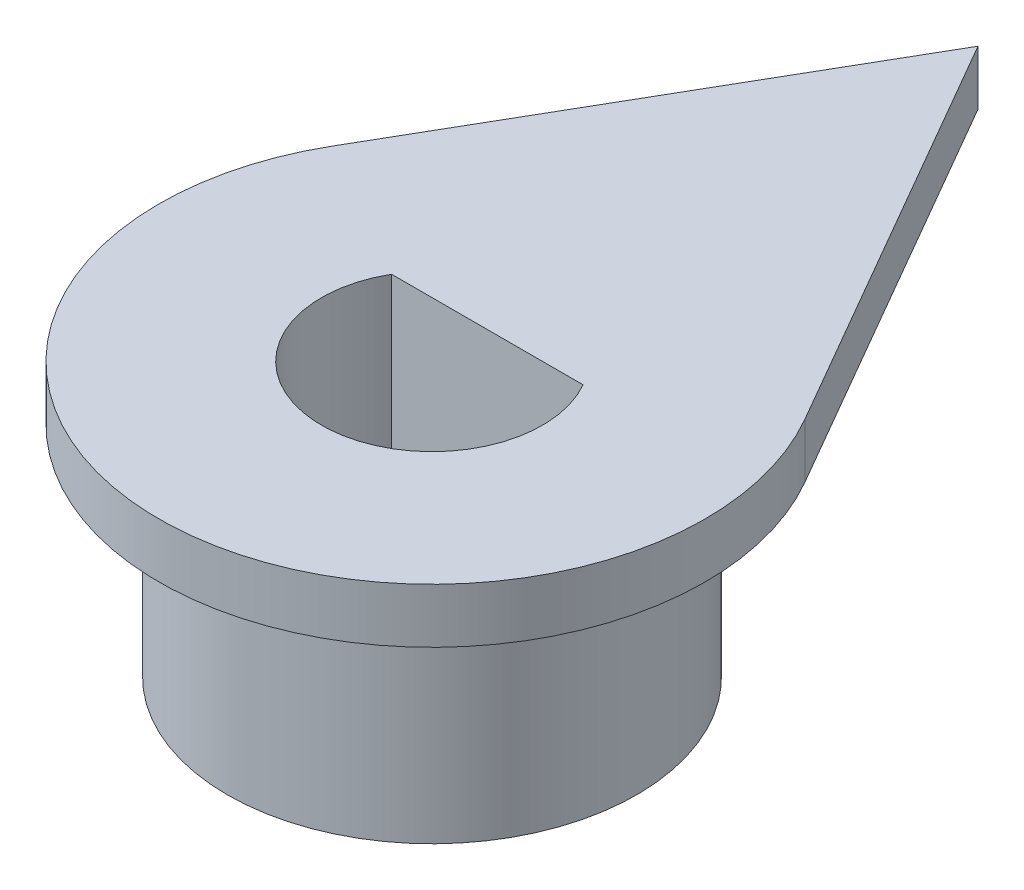
ISO-10303-21;
HEADER;
FILE_DESCRIPTION(('STEP AP214'),'2;1');
FILE_NAME('part.step','',(''),(''),'','','');
FILE_SCHEMA(('AUTOMOTIVE_DESIGN { 1 0 10303 214 1 1 1 1 }'));
ENDSEC;
DATA;
#1=APPLICATION_CONTEXT('core data for automotive mechanical design processes');
#2=APPLICATION_PROTOCOL_DEFINITION('international standard','automotive_design',2000,#1);
#3=PRODUCT_CONTEXT('',#1,'mechanical');
#4=PRODUCT('Part','Part','',(#3));
#5=PRODUCT_RELATED_PRODUCT_CATEGORY('part','',(#4));
#6=PRODUCT_DEFINITION_FORMATION('','',#4);
#7=PRODUCT_DEFINITION_CONTEXT('part definition',#1,'design');
#8=PRODUCT_DEFINITION('design','',#6,#7);
#9=PRODUCT_DEFINITION_SHAPE('','',#8);
#10=(LENGTH_UNIT() NAMED_UNIT(*) SI_UNIT(.MILLI.,.METRE.));
#11=(NAMED_UNIT(*) PLANE_ANGLE_UNIT() SI_UNIT($,.RADIAN.));
#12=(NAMED_UNIT(*) SI_UNIT($,.STERADIAN.) SOLID_ANGLE_UNIT());
#13=UNCERTAINTY_MEASURE_WITH_UNIT(LENGTH_MEASURE(1.E-05),#10,'distance_accuracy_value','');
#14=(GEOMETRIC_REPRESENTATION_CONTEXT(3) GLOBAL_UNCERTAINTY_ASSIGNED_CONTEXT((#13)) GLOBAL_UNIT_ASSIGNED_CONTEXT((#10,
#11,#12)) REPRESENTATION_CONTEXT('',''));
#15=CARTESIAN_POINT('',(0.,0.,0.));
#16=DIRECTION('',(0.,0.,1.));
#17=DIRECTION('',(1.,0.,0.));
#18=AXIS2_PLACEMENT_3D('',#15,#16,#17);
#19=CARTESIAN_POINT('',(0.,10.,0.));
#20=DIRECTION('',(0.,-1.,0.));
#21=DIRECTION('',(0.,0.,-1.));
#22=AXIS2_PLACEMENT_3D('',#19,#20,#21);
#23=CYLINDRICAL_SURFACE('',#22,7.5);
#24=CARTESIAN_POINT('',(0.,4.95,-7.5));
#25=CARTESIAN_POINT('',(-0.0806421427634559,4.94999696970773,-7.499998525365));
#26=CARTESIAN_POINT('',(-0.161323192666839,4.94324986589986,-7.49868597665242));
#27=CARTESIAN_POINT('',(-0.320408543714804,4.91645895635309,-7.49357651302592));
#28=CARTESIAN_POINT('',(-0.398810919860974,4.89640423082013,-7.48977755788418));
#29=CARTESIAN_POINT('',(-0.55101548040217,4.84363770632334,-7.48011989701473));
#30=CARTESIAN_POINT('',(-0.624821861561572,4.81093765701646,-7.47426310382905));
#31=CARTESIAN_POINT('',(-0.765894660004341,4.73384279646442,-7.46112800440237));
#32=CARTESIAN_POINT('',(-0.833161541699101,4.68944881651136,-7.45384979921549));
#33=CARTESIAN_POINT('',(-0.960105935767713,4.58962831661002,-7.43857083725651));
#34=CARTESIAN_POINT('',(-1.01968843405788,4.53408206623181,-7.43056280433354));
#35=CARTESIAN_POINT('',(-1.12875042127406,4.41379125741996,-7.41478025299514));
#36=CARTESIAN_POINT('',(-1.17822915593394,4.34904601287441,-7.40700575205027));
#37=CARTESIAN_POINT('',(-1.26607852812105,4.21151811528634,-7.3924996521021));
#38=CARTESIAN_POINT('',(-1.30435171779212,4.13867213916168,-7.38577742580521));
#39=CARTESIAN_POINT('',(-1.36807953082819,3.9874323061246,-7.37423989227902));
#40=CARTESIAN_POINT('',(-1.39353533308812,3.90903896019504,-7.36942440968335));
#41=CARTESIAN_POINT('',(-1.43059921980694,3.74994893605672,-7.36231900353129));
#42=CARTESIAN_POINT('',(-1.44237346906097,3.6692923494942,-7.35999880074007));
#43=CARTESIAN_POINT('',(-1.45225595276949,3.5071177140268,-7.35805543655615));
#44=CARTESIAN_POINT('',(-1.4503654913325,3.42559974807015,-7.35843201779251));
#45=CARTESIAN_POINT('',(-1.43310677489635,3.26522561742081,-7.36181213102633));
#46=CARTESIAN_POINT('',(-1.41792817142252,3.18634814859589,-7.36477869652922));
#47=CARTESIAN_POINT('',(-1.37482302272976,3.03228076949582,-7.37294639178685));
#48=CARTESIAN_POINT('',(-1.34689590489551,2.95709102502739,-7.3781476219137));
#49=CARTESIAN_POINT('',(-1.27890302001373,2.811982384737,-7.39023685221375));
#50=CARTESIAN_POINT('',(-1.2387613216085,2.74209997850525,-7.39713535049046));
#51=CARTESIAN_POINT('',(-1.1475323938677,2.60999155808056,-7.4118349819013));
#52=CARTESIAN_POINT('',(-1.0964439860049,2.54776636940327,-7.4196362121823));
#53=CARTESIAN_POINT('',(-0.983752591319254,2.43164362148412,-7.43542295452934));
#54=CARTESIAN_POINT('',(-0.92198754875647,2.3779033275965,-7.44340936221107));
#55=CARTESIAN_POINT('',(-0.790236717207603,2.2815223704328,-7.45854648475334));
#56=CARTESIAN_POINT('',(-0.720250835622369,2.23888183220125,-7.46569719019877));
#57=CARTESIAN_POINT('',(-0.573876038492479,2.16588491360397,-7.47837305941719));
#58=CARTESIAN_POINT('',(-0.497478386568492,2.13554563343671,-7.48389595745544));
#59=CARTESIAN_POINT('',(-0.340540262854947,2.08817542819639,-7.49267657252717));
#60=CARTESIAN_POINT('',(-0.260000260543013,2.07114299850448,-7.49593454565336));
#61=CARTESIAN_POINT('',(-0.09841595866289,2.05109060188821,-7.49978282464045));
#62=CARTESIAN_POINT('',(-0.0173993302005811,2.04785527642259,-7.50041412629724));
#63=CARTESIAN_POINT('',(0.14401707311994,2.05491018919085,-7.4990514624244));
#64=CARTESIAN_POINT('',(0.224416880061964,2.06519971906899,-7.49705763438426));
#65=CARTESIAN_POINT('',(0.381628937454282,2.09883326755743,-7.49069432579966));
#66=CARTESIAN_POINT('',(0.458465530069153,2.12206761241448,-7.48634481210944));
#67=CARTESIAN_POINT('',(0.607152511027312,2.18081203605034,-7.47575591580864));
#68=CARTESIAN_POINT('',(0.679002543998769,2.2163229886566,-7.46951639867483));
#69=CARTESIAN_POINT('',(0.81659097073648,2.29908431022857,-7.45573739482256));
#70=CARTESIAN_POINT('',(0.882249295714527,2.34646538377945,-7.44818374153436));
#71=CARTESIAN_POINT('',(1.00476039132023,2.4514459619466,-7.43264938179644));
#72=CARTESIAN_POINT('',(1.06161228293827,2.50904648538255,-7.42466863282322));
#73=CARTESIAN_POINT('',(1.16572093482627,2.63380838973523,-7.4090425508686));
#74=CARTESIAN_POINT('',(1.21283031760487,2.70109368192709,-7.4014035731401));
#75=CARTESIAN_POINT('',(1.29507841301326,2.84274911537819,-7.38745689020874));
#76=CARTESIAN_POINT('',(1.33021758705248,2.91711898341052,-7.38114913369555));
#77=CARTESIAN_POINT('',(1.38732238328669,3.07046969230392,-7.37062962251973));
#78=CARTESIAN_POINT('',(1.40935381501805,3.1494252761417,-7.36640741549497));
#79=CARTESIAN_POINT('',(1.43981920143142,3.31000731569905,-7.36051395801081));
#80=CARTESIAN_POINT('',(1.44825479907043,3.39163344748594,-7.35884239932553));
#81=CARTESIAN_POINT('',(1.45123139559094,3.55376172056792,-7.35825581479954));
#82=CARTESIAN_POINT('',(1.44600504939331,3.63425951454366,-7.35929463226338));
#83=CARTESIAN_POINT('',(1.42231736522539,3.79320571889761,-7.36390904565127));
#84=CARTESIAN_POINT('',(1.4038561184835,3.87165414339829,-7.36748462408938));
#85=CARTESIAN_POINT('',(1.35432344783031,4.0241390828255,-7.37674968990959));
#86=CARTESIAN_POINT('',(1.32327875189259,4.09818456994134,-7.382434694597));
#87=CARTESIAN_POINT('',(1.24948643514521,4.24005281280265,-7.39528093736711));
#88=CARTESIAN_POINT('',(1.20673791596219,4.30787509032721,-7.40244228876222));
#89=CARTESIAN_POINT('',(1.10994910376903,4.43653393922659,-7.41757665987797));
#90=CARTESIAN_POINT('',(1.05574008359523,4.49724229612996,-7.42556077438229));
#91=CARTESIAN_POINT('',(0.937919333480724,4.60877815222669,-7.44135962378414));
#92=CARTESIAN_POINT('',(0.874305446703064,4.65960337869519,-7.44917431935586));
#93=CARTESIAN_POINT('',(0.73874298379102,4.75039151691554,-7.46384264913767));
#94=CARTESIAN_POINT('',(0.666719791654772,4.79024469079006,-7.47068626414688));
#95=CARTESIAN_POINT('',(0.516888791372671,4.85722027409429,-7.48254317852271));
#96=CARTESIAN_POINT('',(0.439086393305171,4.88435442042765,-7.48755816436428));
#97=CARTESIAN_POINT('',(0.300899668743571,4.91972867217436,-7.49419237380928));
#98=CARTESIAN_POINT('',(0.241313712590987,4.931060637462,-7.4963577306211));
#99=CARTESIAN_POINT('',(0.121159140467246,4.94619733338625,-7.49926207753944));
#100=CARTESIAN_POINT('',(0.0605905523240662,4.95000227681304,-7.50000110796844));
#101=CARTESIAN_POINT('',(0.,4.95,-7.5));
#102=B_SPLINE_CURVE_WITH_KNOTS('',3,(#24,#25,#26,#27,#28,#29,#30,#31,#32,#33,#34,#35,#36,#37,
#38,#39,#40,#41,#42,#43,#44,#45,#46,#47,#48,#49,#50,#51,#52,#53,#54,#55,#56,#57,#58,#59,#60,#61,
#62,#63,#64,#65,#66,#67,#68,#69,#70,#71,#72,#73,#74,#75,#76,#77,#78,#79,#80,#81,#82,#83,#84,#85,
#86,#87,#88,#89,#90,#91,#92,#93,#94,#95,#96,#97,#98,#99,#100,#101),.UNSPECIFIED.,.T.,.F.,(4,2,2,
2,2,2,2,2,2,2,2,2,2,2,2,2,2,2,2,2,2,2,2,2,2,2,2,2,2,2,2,2,2,2,2,2,2,2,4),(0.,0.241704810649837,
0.483608201937102,0.725287361809706,0.966949345953302,1.21135973972972,1.45578837256521,
1.70228348184305,1.94875591528754,2.19220253374382,2.43562591887866,2.67563072842972,
2.91564631915497,3.15718554095799,3.39875078005028,3.64436964818046,3.88999128321554,
4.13595320018157,4.38188730196191,4.62396824505461,4.86603650981644,5.10608439476873,
5.34614936942841,5.58898383147776,5.83184251632734,6.07814249251754,6.32443297363543,
6.56947624394217,6.81448990034292,7.05535840625102,7.29622525186418,7.53658314120013,
7.77695948533422,8.02115769748762,8.26541199922855,8.5120271406285,8.75841425955026,
8.94002453811927,9.12162968246192),.UNSPECIFIED.);
#103=CARTESIAN_POINT('',(0.,4.95,-7.5));
#104=VERTEX_POINT('',#103);
#105=EDGE_CURVE('E155',#104,#104,#102,.T.);
#106=ORIENTED_EDGE('',*,*,#105,.T.);
#107=EDGE_LOOP('',(#106));
#108=FACE_BOUND('',#107,.T.);
#109=CARTESIAN_POINT('',(0.,0.,0.));
#110=DIRECTION('',(0.,1.,0.));
#111=DIRECTION('',(0.,0.,1.));
#112=AXIS2_PLACEMENT_3D('',#109,#110,#111);
#113=CIRCLE('',#112,7.5);
#114=CARTESIAN_POINT('',(0.,0.,7.5));
#115=VERTEX_POINT('',#114);
#116=EDGE_CURVE('E49',#115,#115,#113,.T.);
#117=ORIENTED_EDGE('',*,*,#116,.T.);
#118=EDGE_LOOP('',(#117));
#119=FACE_BOUND('',#118,.T.);
#120=CARTESIAN_POINT('',(0.,8.,0.));
#121=DIRECTION('',(0.,1.,0.));
#122=DIRECTION('',(0.,0.,1.));
#123=AXIS2_PLACEMENT_3D('',#120,#121,#122);
#124=CIRCLE('',#123,7.5);
#125=CARTESIAN_POINT('',(0.,8.,7.5));
#126=VERTEX_POINT('',#125);
#127=EDGE_CURVE('E11',#126,#126,#124,.T.);
#128=ORIENTED_EDGE('',*,*,#127,.F.);
#129=EDGE_LOOP('',(#128));
#130=FACE_BOUND('',#129,.T.);
#131=ADVANCED_FACE('F39',(#108,#119,#130),#23,.T.);
#132=CARTESIAN_POINT('',(0.,10.,0.));
#133=DIRECTION('',(0.,1.,0.));
#134=DIRECTION('',(0.,0.,1.));
#135=AXIS2_PLACEMENT_3D('',#132,#133,#134);
#136=PLANE('',#135);
#137=CARTESIAN_POINT('',(0.,10.,0.));
#138=DIRECTION('',(0.,1.,0.));
#139=DIRECTION('',(0.,0.,1.));
#140=AXIS2_PLACEMENT_3D('',#137,#138,#139);
#141=CIRCLE('',#140,4.05);
#142=CARTESIAN_POINT('',(-3.50740288532697,10.,-2.025));
#143=VERTEX_POINT('',#142);
#144=CARTESIAN_POINT('',(3.50740288532697,10.,-2.025));
#145=VERTEX_POINT('',#144);
#146=EDGE_CURVE('E112',#143,#145,#141,.T.);
#147=ORIENTED_EDGE('',*,*,#146,.F.);
#148=DIRECTION('',(-1.,0.,0.));
#149=VECTOR('',#148,1.);
#150=CARTESIAN_POINT('',(-3.50740288532697,10.,-2.025));
#151=LINE('',#150,#149);
#152=EDGE_CURVE('E100',#145,#143,#151,.T.);
#153=ORIENTED_EDGE('',*,*,#152,.F.);
#154=EDGE_LOOP('',(#147,#153));
#155=FACE_BOUND('',#154,.T.);
#156=CARTESIAN_POINT('',(0.,10.,0.));
#157=DIRECTION('',(0.,1.,0.));
#158=DIRECTION('',(0.,0.,1.));
#159=AXIS2_PLACEMENT_3D('',#156,#157,#158);
#160=CIRCLE('',#159,10.);
#161=CARTESIAN_POINT('',(-8.6602540378444,10.,-4.99999999999998));
#162=VERTEX_POINT('',#161);
#163=CARTESIAN_POINT('',(8.6602540378444,10.,-4.99999999999998));
#164=VERTEX_POINT('',#163);
#165=EDGE_CURVE('E141',#162,#164,#160,.T.);
#166=ORIENTED_EDGE('',*,*,#165,.T.);
#167=DIRECTION('',(-0.499999999999998,0.,-0.86602540378444));
#168=VECTOR('',#167,1.);
#169=CARTESIAN_POINT('',(0.,10.,-20.0000000000001));
#170=LINE('',#169,#168);
#171=CARTESIAN_POINT('',(0.,10.,-20.0000000000001));
#172=VERTEX_POINT('',#171);
#173=EDGE_CURVE('E137',#164,#172,#170,.T.);
#174=ORIENTED_EDGE('',*,*,#173,.T.);
#175=DIRECTION('',(-0.499999999999998,0.,0.86602540378444));
#176=VECTOR('',#175,1.);
#177=CARTESIAN_POINT('',(-8.6602540378444,10.,-4.99999999999998));
#178=LINE('',#177,#176);
#179=EDGE_CURVE('E132',#172,#162,#178,.T.);
#180=ORIENTED_EDGE('',*,*,#179,.T.);
#181=EDGE_LOOP('',(#166,#174,#180));
#182=FACE_BOUND('',#181,.T.);
#183=ADVANCED_FACE('F110',(#155,#182),#136,.T.);
#184=CARTESIAN_POINT('',(0.,0.,0.));
#185=DIRECTION('',(0.,1.,0.));
#186=DIRECTION('',(0.,0.,1.));
#187=AXIS2_PLACEMENT_3D('',#184,#185,#186);
#188=PLANE('',#187);
#189=ORIENTED_EDGE('',*,*,#116,.F.);
#190=EDGE_LOOP('',(#189));
#191=FACE_BOUND('',#190,.T.);
#192=CARTESIAN_POINT('',(0.,0.,0.));
#193=DIRECTION('',(0.,1.,0.));
#194=DIRECTION('',(0.,0.,1.));
#195=AXIS2_PLACEMENT_3D('',#192,#193,#194);
#196=CIRCLE('',#195,4.05);
#197=CARTESIAN_POINT('',(-3.50740288532697,0.,-2.025));
#198=VERTEX_POINT('',#197);
#199=CARTESIAN_POINT('',(3.50740288532697,0.,-2.025));
#200=VERTEX_POINT('',#199);
#201=EDGE_CURVE('E117',#198,#200,#196,.T.);
#202=ORIENTED_EDGE('',*,*,#201,.T.);
#203=DIRECTION('',(-1.,0.,0.));
#204=VECTOR('',#203,1.);
#205=CARTESIAN_POINT('',(-3.50740288532697,0.,-2.025));
#206=LINE('',#205,#204);
#207=EDGE_CURVE('E56',#200,#198,#206,.T.);
#208=ORIENTED_EDGE('',*,*,#207,.T.);
#209=EDGE_LOOP('',(#202,#208));
#210=FACE_BOUND('',#209,.T.);
#211=ADVANCED_FACE('F186',(#191,#210),#188,.F.);
#212=CARTESIAN_POINT('',(0.,10.,0.));
#213=DIRECTION('',(0.,-1.,0.));
#214=DIRECTION('',(0.,0.,-1.));
#215=AXIS2_PLACEMENT_3D('',#212,#213,#214);
#216=CYLINDRICAL_SURFACE('',#215,4.05);
#217=DIRECTION('',(0.,-1.,0.));
#218=VECTOR('',#217,1.);
#219=CARTESIAN_POINT('',(-3.50740288532697,10.,-2.025));
#220=LINE('',#219,#218);
#221=EDGE_CURVE('E106',#143,#198,#220,.T.);
#222=ORIENTED_EDGE('',*,*,#221,.F.);
#223=ORIENTED_EDGE('',*,*,#146,.T.);
#224=DIRECTION('',(0.,-1.,0.));
#225=VECTOR('',#224,1.);
#226=CARTESIAN_POINT('',(3.50740288532697,10.,-2.025));
#227=LINE('',#226,#225);
#228=EDGE_CURVE('E97',#145,#200,#227,.T.);
#229=ORIENTED_EDGE('',*,*,#228,.T.);
#230=ORIENTED_EDGE('',*,*,#201,.F.);
#231=EDGE_LOOP('',(#222,#223,#229,#230));
#232=FACE_BOUND('',#231,.T.);
#233=ADVANCED_FACE('F115',(#232),#216,.F.);
#234=CARTESIAN_POINT('',(0.,8.,0.));
#235=DIRECTION('',(0.,1.,0.));
#236=DIRECTION('',(0.,0.,1.));
#237=AXIS2_PLACEMENT_3D('',#234,#235,#236);
#238=PLANE('',#237);
#239=CARTESIAN_POINT('',(0.,8.,0.));
#240=DIRECTION('',(0.,1.,0.));
#241=DIRECTION('',(0.,0.,1.));
#242=AXIS2_PLACEMENT_3D('',#239,#240,#241);
#243=CIRCLE('',#242,10.);
#244=CARTESIAN_POINT('',(-8.6602540378444,8.,-4.99999999999998));
#245=VERTEX_POINT('',#244);
#246=CARTESIAN_POINT('',(8.6602540378444,8.,-4.99999999999998));
#247=VERTEX_POINT('',#246);
#248=EDGE_CURVE('E136',#245,#247,#243,.T.);
#249=ORIENTED_EDGE('',*,*,#248,.F.);
#250=DIRECTION('',(-0.499999999999998,0.,0.86602540378444));
#251=VECTOR('',#250,1.);
#252=CARTESIAN_POINT('',(-8.6602540378444,8.,-4.99999999999998));
#253=LINE('',#252,#251);
#254=CARTESIAN_POINT('',(0.,8.,-20.0000000000001));
#255=VERTEX_POINT('',#254);
#256=EDGE_CURVE('E127',#255,#245,#253,.T.);
#257=ORIENTED_EDGE('',*,*,#256,.F.);
#258=DIRECTION('',(-0.499999999999998,0.,-0.86602540378444));
#259=VECTOR('',#258,1.);
#260=CARTESIAN_POINT('',(0.,8.,-20.0000000000001));
#261=LINE('',#260,#259);
#262=EDGE_CURVE('E147',#247,#255,#261,.T.);
#263=ORIENTED_EDGE('',*,*,#262,.F.);
#264=EDGE_LOOP('',(#249,#257,#263));
#265=FACE_BOUND('',#264,.T.);
#266=ORIENTED_EDGE('',*,*,#127,.T.);
#267=EDGE_LOOP('',(#266));
#268=FACE_BOUND('',#267,.T.);
#269=ADVANCED_FACE('F172',(#265,#268),#238,.F.);
#270=CARTESIAN_POINT('',(0.,8.,0.));
#271=DIRECTION('',(0.,1.,0.));
#272=DIRECTION('',(0.,0.,1.));
#273=AXIS2_PLACEMENT_3D('',#270,#271,#272);
#274=CYLINDRICAL_SURFACE('',#273,10.);
#275=ORIENTED_EDGE('',*,*,#165,.F.);
#276=DIRECTION('',(0.,1.,0.));
#277=VECTOR('',#276,1.);
#278=CARTESIAN_POINT('',(-8.6602540378444,8.,-4.99999999999998));
#279=LINE('',#278,#277);
#280=EDGE_CURVE('E65',#245,#162,#279,.T.);
#281=ORIENTED_EDGE('',*,*,#280,.F.);
#282=ORIENTED_EDGE('',*,*,#248,.T.);
#283=DIRECTION('',(0.,1.,0.));
#284=VECTOR('',#283,1.);
#285=CARTESIAN_POINT('',(8.6602540378444,8.,-4.99999999999998));
#286=LINE('',#285,#284);
#287=EDGE_CURVE('E86',#247,#164,#286,.T.);
#288=ORIENTED_EDGE('',*,*,#287,.T.);
#289=EDGE_LOOP('',(#275,#281,#282,#288));
#290=FACE_BOUND('',#289,.T.);
#291=ADVANCED_FACE('F175',(#290),#274,.T.);
#292=CARTESIAN_POINT('',(-8.6602540378444,8.,-4.99999999999998));
#293=DIRECTION('',(-0.86602540378444,0.,-0.499999999999998));
#294=DIRECTION('',(-0.499999999999998,0.,0.86602540378444));
#295=AXIS2_PLACEMENT_3D('',#292,#293,#294);
#296=PLANE('',#295);
#297=ORIENTED_EDGE('',*,*,#179,.F.);
#298=DIRECTION('',(0.,1.,0.));
#299=VECTOR('',#298,1.);
#300=CARTESIAN_POINT('',(0.,8.,-20.0000000000001));
#301=LINE('',#300,#299);
#302=EDGE_CURVE('E126',#255,#172,#301,.T.);
#303=ORIENTED_EDGE('',*,*,#302,.F.);
#304=ORIENTED_EDGE('',*,*,#256,.T.);
#305=ORIENTED_EDGE('',*,*,#280,.T.);
#306=EDGE_LOOP('',(#297,#303,#304,#305));
#307=FACE_BOUND('',#306,.T.);
#308=ADVANCED_FACE('F177',(#307),#296,.T.);
#309=CARTESIAN_POINT('',(0.,8.,-20.0000000000001));
#310=DIRECTION('',(0.86602540378444,0.,-0.499999999999998));
#311=DIRECTION('',(-0.499999999999998,0.,-0.86602540378444));
#312=AXIS2_PLACEMENT_3D('',#309,#310,#311);
#313=PLANE('',#312);
#314=ORIENTED_EDGE('',*,*,#173,.F.);
#315=ORIENTED_EDGE('',*,*,#287,.F.);
#316=ORIENTED_EDGE('',*,*,#262,.T.);
#317=ORIENTED_EDGE('',*,*,#302,.T.);
#318=EDGE_LOOP('',(#314,#315,#316,#317));
#319=FACE_BOUND('',#318,.T.);
#320=ADVANCED_FACE('F170',(#319),#313,.T.);
#321=CARTESIAN_POINT('',(-3.50740288532697,10.,-2.025));
#322=DIRECTION('',(0.,0.,1.));
#323=DIRECTION('',(1.,0.,0.));
#324=AXIS2_PLACEMENT_3D('',#321,#322,#323);
#325=PLANE('',#324);
#326=CARTESIAN_POINT('',(0.,3.5,-2.025));
#327=DIRECTION('',(0.,0.,1.));
#328=DIRECTION('',(1.,0.,0.));
#329=AXIS2_PLACEMENT_3D('',#326,#327,#328);
#330=CIRCLE('',#329,1.45);
#331=CARTESIAN_POINT('',(1.45,3.5,-2.025));
#332=VERTEX_POINT('',#331);
#333=EDGE_CURVE('E43',#332,#332,#330,.T.);
#334=ORIENTED_EDGE('',*,*,#333,.F.);
#335=EDGE_LOOP('',(#334));
#336=FACE_BOUND('',#335,.T.);
#337=ORIENTED_EDGE('',*,*,#207,.F.);
#338=ORIENTED_EDGE('',*,*,#228,.F.);
#339=ORIENTED_EDGE('',*,*,#152,.T.);
#340=ORIENTED_EDGE('',*,*,#221,.T.);
#341=EDGE_LOOP('',(#337,#338,#339,#340));
#342=FACE_BOUND('',#341,.T.);
#343=ADVANCED_FACE('F99',(#336,#342),#325,.T.);
#344=CARTESIAN_POINT('',(0.,3.5,-10.));
#345=DIRECTION('',(0.,0.,1.));
#346=DIRECTION('',(1.,0.,0.));
#347=AXIS2_PLACEMENT_3D('',#344,#345,#346);
#348=CYLINDRICAL_SURFACE('',#347,1.45);
#349=ORIENTED_EDGE('',*,*,#333,.T.);
#350=EDGE_LOOP('',(#349));
#351=FACE_BOUND('',#350,.T.);
#352=ORIENTED_EDGE('',*,*,#105,.F.);
#353=EDGE_LOOP('',(#352));
#354=FACE_BOUND('',#353,.T.);
#355=ADVANCED_FACE('F163',(#351,#354),#348,.F.);
#356=CLOSED_SHELL('',(#131,#183,#211,#233,#269,#291,#308,#320,#343,#355));
#357=MANIFOLD_SOLID_BREP('B2',#356);
#358=ADVANCED_BREP_SHAPE_REPRESENTATION('',(#18,#357),#14);
#359=SHAPE_DEFINITION_REPRESENTATION(#9,#358);
ENDSEC;
END-ISO-10303-21;
